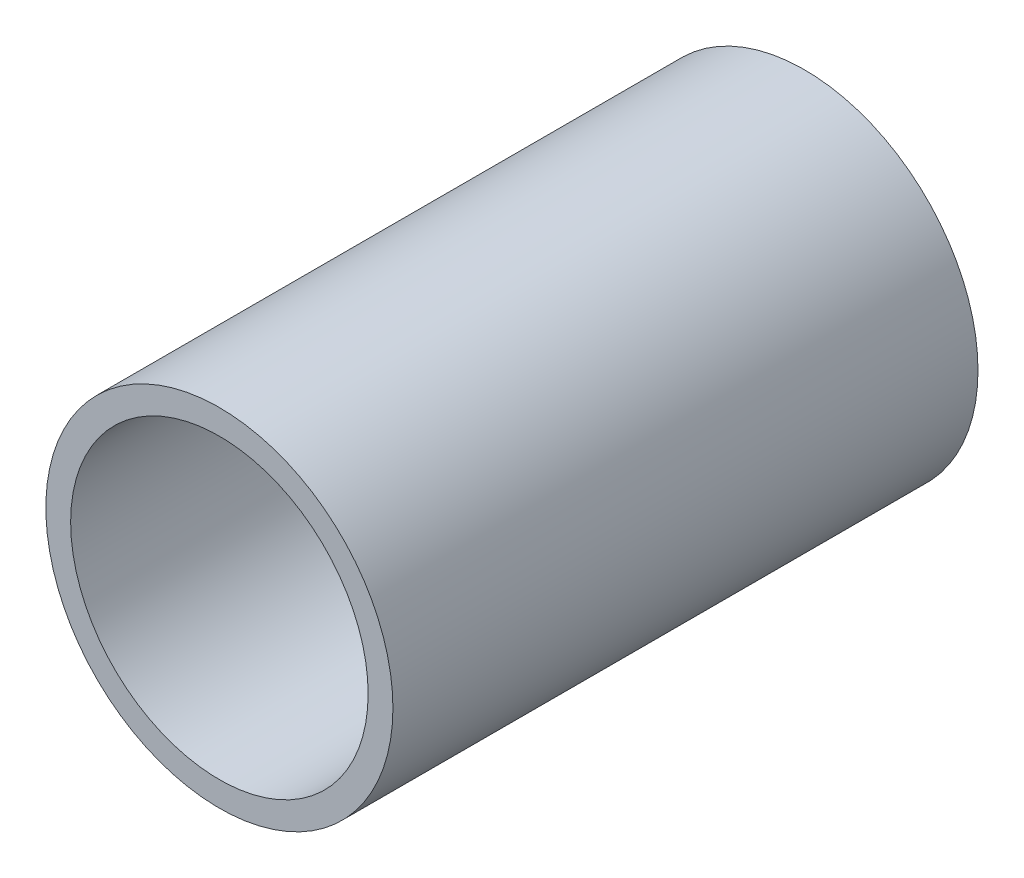
ISO-10303-21;
HEADER;
FILE_DESCRIPTION(('STEP AP214'),'2;1');
FILE_NAME('part.step','',(''),(''),'','','');
FILE_SCHEMA(('AUTOMOTIVE_DESIGN { 1 0 10303 214 1 1 1 1 }'));
ENDSEC;
DATA;
#1=APPLICATION_CONTEXT('core data for automotive mechanical design processes');
#2=APPLICATION_PROTOCOL_DEFINITION('international standard','automotive_design',2000,#1);
#3=PRODUCT_CONTEXT('',#1,'mechanical');
#4=PRODUCT('Part','Part','',(#3));
#5=PRODUCT_RELATED_PRODUCT_CATEGORY('part','',(#4));
#6=PRODUCT_DEFINITION_FORMATION('','',#4);
#7=PRODUCT_DEFINITION_CONTEXT('part definition',#1,'design');
#8=PRODUCT_DEFINITION('design','',#6,#7);
#9=PRODUCT_DEFINITION_SHAPE('','',#8);
#10=(LENGTH_UNIT() NAMED_UNIT(*) SI_UNIT(.MILLI.,.METRE.));
#11=(NAMED_UNIT(*) PLANE_ANGLE_UNIT() SI_UNIT($,.RADIAN.));
#12=(NAMED_UNIT(*) SI_UNIT($,.STERADIAN.) SOLID_ANGLE_UNIT());
#13=UNCERTAINTY_MEASURE_WITH_UNIT(LENGTH_MEASURE(1.E-05),#10,'distance_accuracy_value','');
#14=(GEOMETRIC_REPRESENTATION_CONTEXT(3) GLOBAL_UNCERTAINTY_ASSIGNED_CONTEXT((#13)) GLOBAL_UNIT_ASSIGNED_CONTEXT((#10,
#11,#12)) REPRESENTATION_CONTEXT('',''));
#15=CARTESIAN_POINT('',(0.,0.,0.));
#16=DIRECTION('',(0.,0.,1.));
#17=DIRECTION('',(1.,0.,0.));
#18=AXIS2_PLACEMENT_3D('',#15,#16,#17);
#19=CARTESIAN_POINT('',(0.,0.,74.93));
#20=DIRECTION('',(0.,0.,1.));
#21=DIRECTION('',(1.,0.,0.));
#22=AXIS2_PLACEMENT_3D('',#19,#20,#21);
#23=PLANE('',#22);
#24=CARTESIAN_POINT('',(0.,0.,74.93));
#25=DIRECTION('',(0.,0.,1.));
#26=DIRECTION('',(1.,0.,0.));
#27=AXIS2_PLACEMENT_3D('',#24,#25,#26);
#28=CIRCLE('',#27,44.45);
#29=CARTESIAN_POINT('',(44.45,0.,74.93));
#30=VERTEX_POINT('',#29);
#31=EDGE_CURVE('E10',#30,#30,#28,.T.);
#32=ORIENTED_EDGE('',*,*,#31,.T.);
#33=EDGE_LOOP('',(#32));
#34=FACE_BOUND('',#33,.T.);
#35=CARTESIAN_POINT('',(0.,0.,74.93));
#36=DIRECTION('',(0.,0.,1.));
#37=DIRECTION('',(1.,0.,0.));
#38=AXIS2_PLACEMENT_3D('',#35,#36,#37);
#39=CIRCLE('',#38,38.1);
#40=CARTESIAN_POINT('',(38.1,0.,74.93));
#41=VERTEX_POINT('',#40);
#42=EDGE_CURVE('E42',#41,#41,#39,.T.);
#43=ORIENTED_EDGE('',*,*,#42,.F.);
#44=EDGE_LOOP('',(#43));
#45=FACE_BOUND('',#44,.T.);
#46=ADVANCED_FACE('F31',(#34,#45),#23,.T.);
#47=CARTESIAN_POINT('',(0.,0.,-74.93));
#48=DIRECTION('',(0.,0.,1.));
#49=DIRECTION('',(1.,0.,0.));
#50=AXIS2_PLACEMENT_3D('',#47,#48,#49);
#51=PLANE('',#50);
#52=CARTESIAN_POINT('',(0.,0.,-74.93));
#53=DIRECTION('',(0.,0.,1.));
#54=DIRECTION('',(1.,0.,0.));
#55=AXIS2_PLACEMENT_3D('',#52,#53,#54);
#56=CIRCLE('',#55,44.45);
#57=CARTESIAN_POINT('',(44.45,0.,-74.93));
#58=VERTEX_POINT('',#57);
#59=EDGE_CURVE('E35',#58,#58,#56,.T.);
#60=ORIENTED_EDGE('',*,*,#59,.F.);
#61=EDGE_LOOP('',(#60));
#62=FACE_BOUND('',#61,.T.);
#63=CARTESIAN_POINT('',(0.,0.,-74.93));
#64=DIRECTION('',(0.,0.,1.));
#65=DIRECTION('',(1.,0.,0.));
#66=AXIS2_PLACEMENT_3D('',#63,#64,#65);
#67=CIRCLE('',#66,38.1);
#68=CARTESIAN_POINT('',(38.1,0.,-74.93));
#69=VERTEX_POINT('',#68);
#70=EDGE_CURVE('E44',#69,#69,#67,.T.);
#71=ORIENTED_EDGE('',*,*,#70,.T.);
#72=EDGE_LOOP('',(#71));
#73=FACE_BOUND('',#72,.T.);
#74=ADVANCED_FACE('F54',(#62,#73),#51,.F.);
#75=CARTESIAN_POINT('',(0.,0.,74.93));
#76=DIRECTION('',(0.,0.,-1.));
#77=DIRECTION('',(-1.,0.,0.));
#78=AXIS2_PLACEMENT_3D('',#75,#76,#77);
#79=CYLINDRICAL_SURFACE('',#78,44.45);
#80=ORIENTED_EDGE('',*,*,#31,.F.);
#81=EDGE_LOOP('',(#80));
#82=FACE_BOUND('',#81,.T.);
#83=ORIENTED_EDGE('',*,*,#59,.T.);
#84=EDGE_LOOP('',(#83));
#85=FACE_BOUND('',#84,.T.);
#86=ADVANCED_FACE('F33',(#82,#85),#79,.T.);
#87=CARTESIAN_POINT('',(0.,0.,74.93));
#88=DIRECTION('',(0.,0.,-1.));
#89=DIRECTION('',(-1.,0.,0.));
#90=AXIS2_PLACEMENT_3D('',#87,#88,#89);
#91=CYLINDRICAL_SURFACE('',#90,38.1);
#92=ORIENTED_EDGE('',*,*,#42,.T.);
#93=EDGE_LOOP('',(#92));
#94=FACE_BOUND('',#93,.T.);
#95=ORIENTED_EDGE('',*,*,#70,.F.);
#96=EDGE_LOOP('',(#95));
#97=FACE_BOUND('',#96,.T.);
#98=ADVANCED_FACE('F50',(#94,#97),#91,.F.);
#99=CLOSED_SHELL('',(#46,#74,#86,#98));
#100=MANIFOLD_SOLID_BREP('B2',#99);
#101=ADVANCED_BREP_SHAPE_REPRESENTATION('',(#18,#100),#14);
#102=SHAPE_DEFINITION_REPRESENTATION(#9,#101);
ENDSEC;
END-ISO-10303-21;
